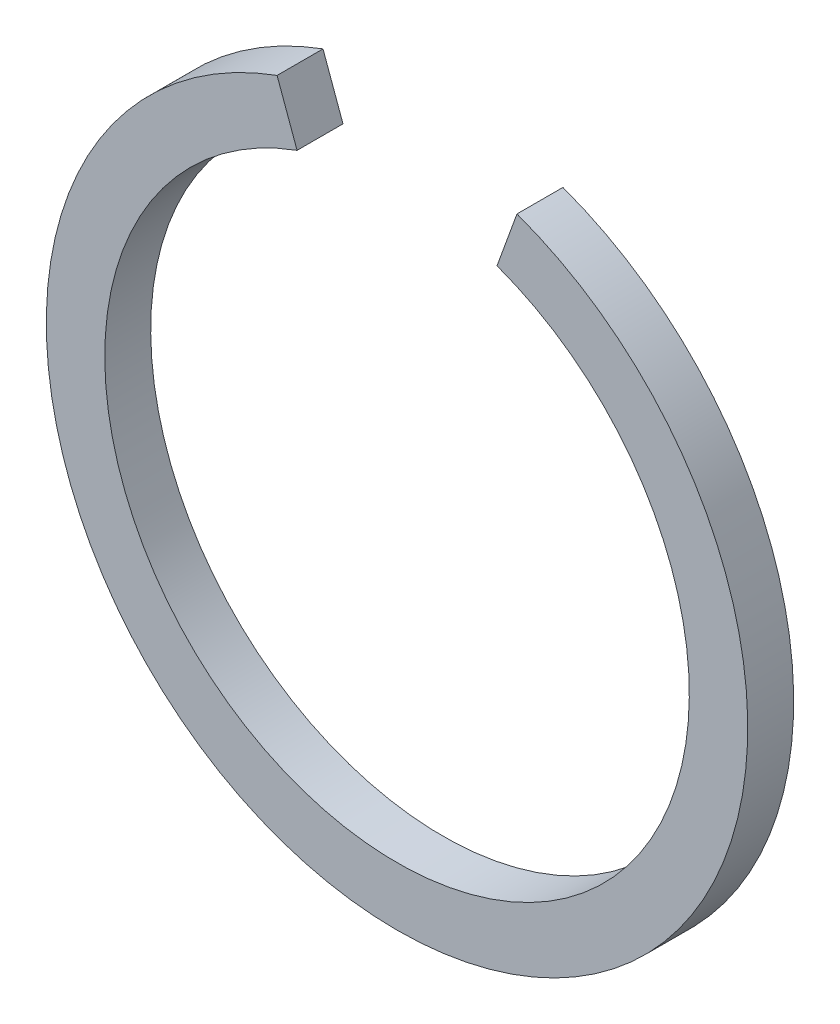
ISO-10303-21;
HEADER;
FILE_DESCRIPTION(('STEP AP214'),'2;1');
FILE_NAME('part.step','',(''),(''),'','','');
FILE_SCHEMA(('AUTOMOTIVE_DESIGN { 1 0 10303 214 1 1 1 1 }'));
ENDSEC;
DATA;
#1=APPLICATION_CONTEXT('core data for automotive mechanical design processes');
#2=APPLICATION_PROTOCOL_DEFINITION('international standard','automotive_design',2000,#1);
#3=PRODUCT_CONTEXT('',#1,'mechanical');
#4=PRODUCT('Part','Part','',(#3));
#5=PRODUCT_RELATED_PRODUCT_CATEGORY('part','',(#4));
#6=PRODUCT_DEFINITION_FORMATION('','',#4);
#7=PRODUCT_DEFINITION_CONTEXT('part definition',#1,'design');
#8=PRODUCT_DEFINITION('design','',#6,#7);
#9=PRODUCT_DEFINITION_SHAPE('','',#8);
#10=(LENGTH_UNIT() NAMED_UNIT(*) SI_UNIT(.MILLI.,.METRE.));
#11=(NAMED_UNIT(*) PLANE_ANGLE_UNIT() SI_UNIT($,.RADIAN.));
#12=(NAMED_UNIT(*) SI_UNIT($,.STERADIAN.) SOLID_ANGLE_UNIT());
#13=UNCERTAINTY_MEASURE_WITH_UNIT(LENGTH_MEASURE(1.E-05),#10,'distance_accuracy_value','');
#14=(GEOMETRIC_REPRESENTATION_CONTEXT(3) GLOBAL_UNCERTAINTY_ASSIGNED_CONTEXT((#13)) GLOBAL_UNIT_ASSIGNED_CONTEXT((#10,
#11,#12)) REPRESENTATION_CONTEXT('',''));
#15=CARTESIAN_POINT('',(0.,0.,0.));
#16=DIRECTION('',(0.,0.,1.));
#17=DIRECTION('',(1.,0.,0.));
#18=AXIS2_PLACEMENT_3D('',#15,#16,#17);
#19=CARTESIAN_POINT('',(0.,0.,1.1));
#20=DIRECTION('',(0.,0.,1.));
#21=DIRECTION('',(1.,0.,0.));
#22=AXIS2_PLACEMENT_3D('',#19,#20,#21);
#23=PLANE('',#22);
#24=DIRECTION('',(0.342020143325669,0.939692620785908,0.));
#25=VECTOR('',#24,1.);
#26=CARTESIAN_POINT('',(2.39414100327969,6.57784834550136,1.1));
#27=LINE('',#26,#25);
#28=CARTESIAN_POINT('',(2.39414100327969,6.57784834550136,1.1));
#29=VERTEX_POINT('',#28);
#30=CARTESIAN_POINT('',(2.87296920393562,7.89341801460163,1.1));
#31=VERTEX_POINT('',#30);
#32=EDGE_CURVE('E83',#29,#31,#27,.T.);
#33=ORIENTED_EDGE('',*,*,#32,.F.);
#34=CARTESIAN_POINT('',(0.,0.,1.1));
#35=DIRECTION('',(0.,0.,1.));
#36=DIRECTION('',(1.,0.,0.));
#37=AXIS2_PLACEMENT_3D('',#34,#35,#36);
#38=CIRCLE('',#37,7.);
#39=CARTESIAN_POINT('',(-2.39414100327969,6.57784834550136,1.1));
#40=VERTEX_POINT('',#39);
#41=EDGE_CURVE('E91',#40,#29,#38,.T.);
#42=ORIENTED_EDGE('',*,*,#41,.F.);
#43=DIRECTION('',(0.342020143325669,-0.939692620785908,0.));
#44=VECTOR('',#43,1.);
#45=CARTESIAN_POINT('',(-2.39414100327969,6.57784834550136,1.1));
#46=LINE('',#45,#44);
#47=CARTESIAN_POINT('',(-2.87296920393562,7.89341801460163,1.1));
#48=VERTEX_POINT('',#47);
#49=EDGE_CURVE('E58',#48,#40,#46,.T.);
#50=ORIENTED_EDGE('',*,*,#49,.F.);
#51=CARTESIAN_POINT('',(0.,0.,1.1));
#52=DIRECTION('',(0.,0.,1.));
#53=DIRECTION('',(1.,0.,0.));
#54=AXIS2_PLACEMENT_3D('',#51,#52,#53);
#55=CIRCLE('',#54,8.4);
#56=EDGE_CURVE('E89',#48,#31,#55,.T.);
#57=ORIENTED_EDGE('',*,*,#56,.T.);
#58=EDGE_LOOP('',(#33,#42,#50,#57));
#59=FACE_BOUND('',#58,.T.);
#60=ADVANCED_FACE('F36',(#59),#23,.T.);
#61=CARTESIAN_POINT('',(0.,0.,0.));
#62=DIRECTION('',(0.,0.,1.));
#63=DIRECTION('',(1.,0.,0.));
#64=AXIS2_PLACEMENT_3D('',#61,#62,#63);
#65=PLANE('',#64);
#66=CARTESIAN_POINT('',(0.,0.,0.));
#67=DIRECTION('',(0.,0.,1.));
#68=DIRECTION('',(1.,0.,0.));
#69=AXIS2_PLACEMENT_3D('',#66,#67,#68);
#70=CIRCLE('',#69,7.);
#71=CARTESIAN_POINT('',(-2.39414100327969,6.57784834550136,0.));
#72=VERTEX_POINT('',#71);
#73=CARTESIAN_POINT('',(2.39414100327969,6.57784834550136,0.));
#74=VERTEX_POINT('',#73);
#75=EDGE_CURVE('E98',#72,#74,#70,.T.);
#76=ORIENTED_EDGE('',*,*,#75,.T.);
#77=DIRECTION('',(0.342020143325669,0.939692620785908,0.));
#78=VECTOR('',#77,1.);
#79=CARTESIAN_POINT('',(0.,0.,0.));
#80=LINE('',#79,#78);
#81=CARTESIAN_POINT('',(2.87296920393562,7.89341801460163,0.));
#82=VERTEX_POINT('',#81);
#83=EDGE_CURVE('E50',#74,#82,#80,.T.);
#84=ORIENTED_EDGE('',*,*,#83,.T.);
#85=CARTESIAN_POINT('',(0.,0.,0.));
#86=DIRECTION('',(0.,0.,1.));
#87=DIRECTION('',(1.,0.,0.));
#88=AXIS2_PLACEMENT_3D('',#85,#86,#87);
#89=CIRCLE('',#88,8.4);
#90=CARTESIAN_POINT('',(-2.87296920393562,7.89341801460163,0.));
#91=VERTEX_POINT('',#90);
#92=EDGE_CURVE('E94',#91,#82,#89,.T.);
#93=ORIENTED_EDGE('',*,*,#92,.F.);
#94=DIRECTION('',(0.342020143325669,-0.939692620785908,0.));
#95=VECTOR('',#94,1.);
#96=CARTESIAN_POINT('',(0.,0.,0.));
#97=LINE('',#96,#95);
#98=EDGE_CURVE('E77',#91,#72,#97,.T.);
#99=ORIENTED_EDGE('',*,*,#98,.T.);
#100=EDGE_LOOP('',(#76,#84,#93,#99));
#101=FACE_BOUND('',#100,.T.);
#102=ADVANCED_FACE('F110',(#101),#65,.F.);
#103=CARTESIAN_POINT('',(0.,0.,1.1));
#104=DIRECTION('',(0.,0.,-1.));
#105=DIRECTION('',(-1.,0.,0.));
#106=AXIS2_PLACEMENT_3D('',#103,#104,#105);
#107=CYLINDRICAL_SURFACE('',#106,8.4);
#108=ORIENTED_EDGE('',*,*,#92,.T.);
#109=DIRECTION('',(0.,0.,1.));
#110=VECTOR('',#109,1.);
#111=CARTESIAN_POINT('',(2.87296920393562,7.89341801460163,-8.9));
#112=LINE('',#111,#110);
#113=EDGE_CURVE('E82',#82,#31,#112,.T.);
#114=ORIENTED_EDGE('',*,*,#113,.T.);
#115=ORIENTED_EDGE('',*,*,#56,.F.);
#116=DIRECTION('',(0.,0.,1.));
#117=VECTOR('',#116,1.);
#118=CARTESIAN_POINT('',(-2.87296920393562,7.89341801460163,-8.9));
#119=LINE('',#118,#117);
#120=EDGE_CURVE('E74',#91,#48,#119,.T.);
#121=ORIENTED_EDGE('',*,*,#120,.F.);
#122=EDGE_LOOP('',(#108,#114,#115,#121));
#123=FACE_BOUND('',#122,.T.);
#124=ADVANCED_FACE('F38',(#123),#107,.T.);
#125=CARTESIAN_POINT('',(0.,0.,1.1));
#126=DIRECTION('',(0.,0.,-1.));
#127=DIRECTION('',(-1.,0.,0.));
#128=AXIS2_PLACEMENT_3D('',#125,#126,#127);
#129=CYLINDRICAL_SURFACE('',#128,7.);
#130=DIRECTION('',(0.,0.,-1.));
#131=VECTOR('',#130,1.);
#132=CARTESIAN_POINT('',(2.39414100327969,6.57784834550136,1.1));
#133=LINE('',#132,#131);
#134=EDGE_CURVE('E11',#74,#29,#133,.F.);
#135=ORIENTED_EDGE('',*,*,#134,.F.);
#136=ORIENTED_EDGE('',*,*,#75,.F.);
#137=DIRECTION('',(0.,0.,-1.));
#138=VECTOR('',#137,1.);
#139=CARTESIAN_POINT('',(-2.39414100327969,6.57784834550136,1.1));
#140=LINE('',#139,#138);
#141=EDGE_CURVE('E44',#40,#72,#140,.T.);
#142=ORIENTED_EDGE('',*,*,#141,.F.);
#143=ORIENTED_EDGE('',*,*,#41,.T.);
#144=EDGE_LOOP('',(#135,#136,#142,#143));
#145=FACE_BOUND('',#144,.T.);
#146=ADVANCED_FACE('F107',(#145),#129,.F.);
#147=CARTESIAN_POINT('',(-2.39414100327969,6.57784834550136,-8.9));
#148=DIRECTION('',(-0.939692620785908,-0.342020143325669,0.));
#149=DIRECTION('',(0.342020143325669,-0.939692620785908,0.));
#150=AXIS2_PLACEMENT_3D('',#147,#148,#149);
#151=PLANE('',#150);
#152=ORIENTED_EDGE('',*,*,#120,.T.);
#153=ORIENTED_EDGE('',*,*,#49,.T.);
#154=ORIENTED_EDGE('',*,*,#141,.T.);
#155=ORIENTED_EDGE('',*,*,#98,.F.);
#156=EDGE_LOOP('',(#152,#153,#154,#155));
#157=FACE_BOUND('',#156,.T.);
#158=ADVANCED_FACE('F75',(#157),#151,.F.);
#159=CARTESIAN_POINT('',(2.39414100327969,6.57784834550136,-8.9));
#160=DIRECTION('',(0.939692620785908,-0.342020143325669,0.));
#161=DIRECTION('',(0.342020143325669,0.939692620785908,0.));
#162=AXIS2_PLACEMENT_3D('',#159,#160,#161);
#163=PLANE('',#162);
#164=ORIENTED_EDGE('',*,*,#134,.T.);
#165=ORIENTED_EDGE('',*,*,#32,.T.);
#166=ORIENTED_EDGE('',*,*,#113,.F.);
#167=ORIENTED_EDGE('',*,*,#83,.F.);
#168=EDGE_LOOP('',(#164,#165,#166,#167));
#169=FACE_BOUND('',#168,.T.);
#170=ADVANCED_FACE('F105',(#169),#163,.F.);
#171=CLOSED_SHELL('',(#60,#102,#124,#146,#158,#170));
#172=MANIFOLD_SOLID_BREP('B2',#171);
#173=ADVANCED_BREP_SHAPE_REPRESENTATION('',(#18,#172),#14);
#174=SHAPE_DEFINITION_REPRESENTATION(#9,#173);
ENDSEC;
END-ISO-10303-21;
